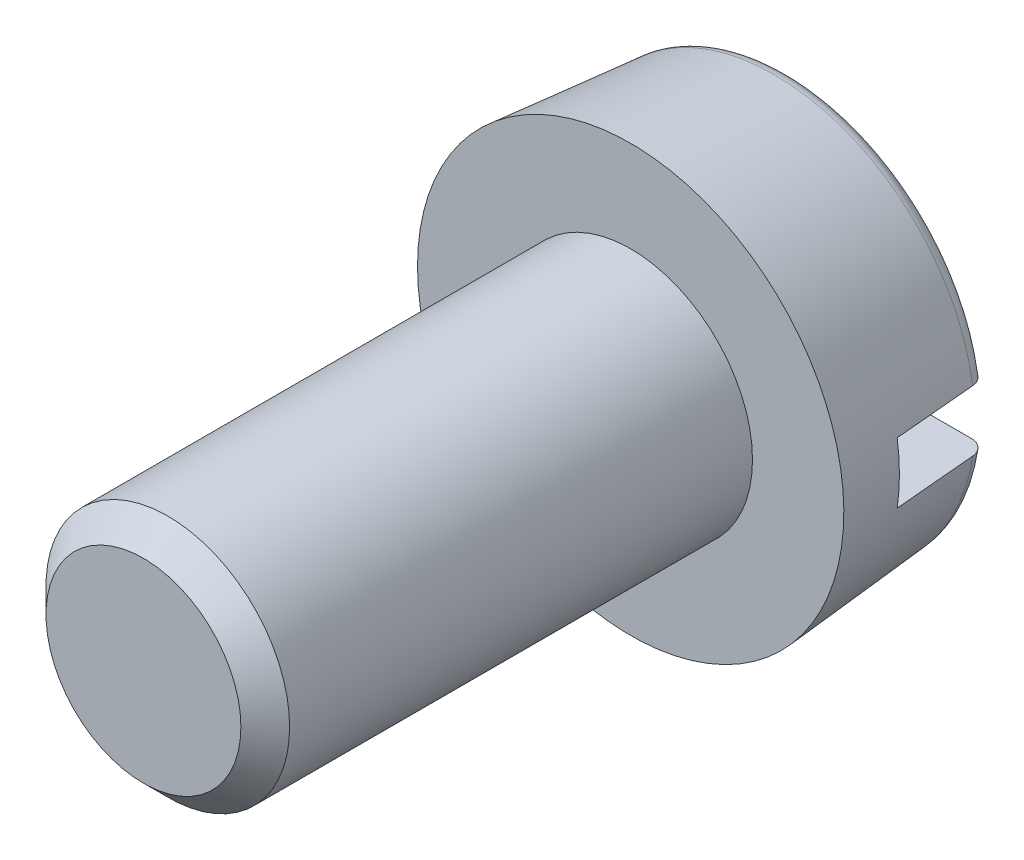
ISO-10303-21;
HEADER;
FILE_DESCRIPTION(('STEP AP214'),'2;1');
FILE_NAME('part.step','',(''),(''),'','','');
FILE_SCHEMA(('AUTOMOTIVE_DESIGN { 1 0 10303 214 1 1 1 1 }'));
ENDSEC;
DATA;
#1=APPLICATION_CONTEXT('core data for automotive mechanical design processes');
#2=APPLICATION_PROTOCOL_DEFINITION('international standard','automotive_design',2000,#1);
#3=PRODUCT_CONTEXT('',#1,'mechanical');
#4=PRODUCT('Part','Part','',(#3));
#5=PRODUCT_RELATED_PRODUCT_CATEGORY('part','',(#4));
#6=PRODUCT_DEFINITION_FORMATION('','',#4);
#7=PRODUCT_DEFINITION_CONTEXT('part definition',#1,'design');
#8=PRODUCT_DEFINITION('design','',#6,#7);
#9=PRODUCT_DEFINITION_SHAPE('','',#8);
#10=(LENGTH_UNIT() NAMED_UNIT(*) SI_UNIT(.MILLI.,.METRE.));
#11=(NAMED_UNIT(*) PLANE_ANGLE_UNIT() SI_UNIT($,.RADIAN.));
#12=(NAMED_UNIT(*) SI_UNIT($,.STERADIAN.) SOLID_ANGLE_UNIT());
#13=UNCERTAINTY_MEASURE_WITH_UNIT(LENGTH_MEASURE(1.E-05),#10,'distance_accuracy_value','');
#14=(GEOMETRIC_REPRESENTATION_CONTEXT(3) GLOBAL_UNCERTAINTY_ASSIGNED_CONTEXT((#13)) GLOBAL_UNIT_ASSIGNED_CONTEXT((#10,
#11,#12)) REPRESENTATION_CONTEXT('',''));
#15=CARTESIAN_POINT('',(0.,0.,0.));
#16=DIRECTION('',(0.,0.,1.));
#17=DIRECTION('',(1.,0.,0.));
#18=AXIS2_PLACEMENT_3D('',#15,#16,#17);
#19=CARTESIAN_POINT('',(0.,0.,-2.6));
#20=DIRECTION('',(0.,0.,1.));
#21=DIRECTION('',(1.,0.,0.));
#22=AXIS2_PLACEMENT_3D('',#19,#20,#21);
#23=PLANE('',#22);
#24=DIRECTION('',(1.,0.,0.));
#25=VECTOR('',#24,1.);
#26=CARTESIAN_POINT('',(-3.5,-0.5,-2.6));
#27=LINE('',#26,#25);
#28=CARTESIAN_POINT('',(-2.99280396400411,-0.5,-2.6));
#29=VERTEX_POINT('',#28);
#30=CARTESIAN_POINT('',(2.99280396400411,-0.5,-2.6));
#31=VERTEX_POINT('',#30);
#32=EDGE_CURVE('E179',#29,#31,#27,.T.);
#33=ORIENTED_EDGE('',*,*,#32,.T.);
#34=CARTESIAN_POINT('',(0.,0.,-2.6));
#35=DIRECTION('',(0.,0.,-1.));
#36=DIRECTION('',(-1.,0.,0.));
#37=AXIS2_PLACEMENT_3D('',#34,#35,#36);
#38=CIRCLE('',#37,3.03428336958807);
#39=EDGE_CURVE('E111',#31,#29,#38,.T.);
#40=ORIENTED_EDGE('',*,*,#39,.T.);
#41=EDGE_LOOP('',(#33,#40));
#42=FACE_BOUND('',#41,.T.);
#43=ADVANCED_FACE('F30',(#42),#23,.F.);
#44=DIRECTION('',(-1.,0.,0.));
#45=VECTOR('',#44,1.);
#46=CARTESIAN_POINT('',(-3.5,0.5,-2.6));
#47=LINE('',#46,#45);
#48=CARTESIAN_POINT('',(2.99280396400411,0.5,-2.6));
#49=VERTEX_POINT('',#48);
#50=CARTESIAN_POINT('',(-2.99280396400411,0.5,-2.6));
#51=VERTEX_POINT('',#50);
#52=EDGE_CURVE('E96',#49,#51,#47,.T.);
#53=ORIENTED_EDGE('',*,*,#52,.T.);
#54=EDGE_CURVE('E108',#51,#49,#38,.T.);
#55=ORIENTED_EDGE('',*,*,#54,.T.);
#56=EDGE_LOOP('',(#53,#55));
#57=FACE_BOUND('',#56,.T.);
#58=ADVANCED_FACE('F173',(#57),#23,.F.);
#59=CARTESIAN_POINT('',(0.,0.,-2.34));
#60=DIRECTION('',(0.,0.,-1.));
#61=DIRECTION('',(-1.,0.,0.));
#62=AXIS2_PLACEMENT_3D('',#59,#60,#61);
#63=TOROIDAL_SURFACE('',#62,3.03428336958807,0.26);
#64=CARTESIAN_POINT('',(-3.20593369474659,-0.5,-2.49273899856779));
#65=CARTESIAN_POINT('',(-3.21452220271325,-0.5,-2.48104813338408));
#66=CARTESIAN_POINT('',(-3.22213584341061,-0.5,-2.4686288627877));
#67=CARTESIAN_POINT('',(-3.23517931236764,-0.5,-2.44267992199898));
#68=CARTESIAN_POINT('',(-3.24060678530229,-0.5,-2.42914907300705));
#69=CARTESIAN_POINT('',(-3.2491065548927,-0.5,-2.40136759729504));
#70=CARTESIAN_POINT('',(-3.25217924219696,-0.5,-2.38711709038131));
#71=CARTESIAN_POINT('',(-3.25587593453628,-0.5,-2.35830538963513));
#72=CARTESIAN_POINT('',(-3.25650051326893,-0.5,-2.34374426939708));
#73=CARTESIAN_POINT('',(-3.25528642330766,-0.5,-2.31478610007677));
#74=CARTESIAN_POINT('',(-3.25345800709215,-0.5,-2.30038862016556));
#75=CARTESIAN_POINT('',(-3.24741106508014,-0.5,-2.27210454535758));
#76=CARTESIAN_POINT('',(-3.24319247697078,-0.5,-2.25821796379022));
#77=CARTESIAN_POINT('',(-3.23248845989605,-0.5,-2.23133883224489));
#78=CARTESIAN_POINT('',(-3.22600169280323,-0.5,-2.21834681544885));
#79=CARTESIAN_POINT('',(-3.21095392642225,-0.5,-2.1936258853226));
#80=CARTESIAN_POINT('',(-3.20239287233723,-0.5,-2.18189700537277));
#81=CARTESIAN_POINT('',(-3.1833771675308,-0.5,-2.1599421385381));
#82=CARTESIAN_POINT('',(-3.17290934342269,-0.5,-2.14972756473587));
#83=CARTESIAN_POINT('',(-3.15042433218451,-0.5,-2.13117694145452));
#84=CARTESIAN_POINT('',(-3.13840706195465,-0.5,-2.12284099279562));
#85=CARTESIAN_POINT('',(-3.11301845792289,-0.5,-2.10818216976063));
#86=CARTESIAN_POINT('',(-3.09963325068401,-0.5,-2.10188332547994));
#87=CARTESIAN_POINT('',(-3.07200360115116,-0.5,-2.09159292949791));
#88=CARTESIAN_POINT('',(-3.05775910228206,-0.5,-2.08760152990051));
#89=CARTESIAN_POINT('',(-3.02863847081055,-0.5,-2.08199385546648));
#90=CARTESIAN_POINT('',(-3.01375693116852,-0.5,-2.0804056431824));
#91=CARTESIAN_POINT('',(-2.98393701863345,-0.5,-2.07973102219478));
#92=CARTESIAN_POINT('',(-2.96899864291793,-0.5,-2.08064473939937));
#93=CARTESIAN_POINT('',(-2.93937852828282,-0.5,-2.08496295941936));
#94=CARTESIAN_POINT('',(-2.92469933000086,-0.5,-2.08838491781102));
#95=CARTESIAN_POINT('',(-2.89612444963107,-0.5,-2.09764767873732));
#96=CARTESIAN_POINT('',(-2.88222877533598,-0.5,-2.10348850532463));
#97=CARTESIAN_POINT('',(-2.85564093115413,-0.5,-2.11742304618296));
#98=CARTESIAN_POINT('',(-2.84294711427197,-0.5,-2.12551361576139));
#99=CARTESIAN_POINT('',(-2.81911627100345,-0.5,-2.14373207198906));
#100=CARTESIAN_POINT('',(-2.80797917064795,-0.5,-2.15385986178169));
#101=CARTESIAN_POINT('',(-2.78770744597602,-0.5,-2.175756076833));
#102=CARTESIAN_POINT('',(-2.77855308328318,-0.5,-2.18750622142483));
#103=CARTESIAN_POINT('',(-2.76238342374972,-0.5,-2.21239644834434));
#104=CARTESIAN_POINT('',(-2.75536793604153,-0.5,-2.22553640650768));
#105=CARTESIAN_POINT('',(-2.74378882508634,-0.5,-2.25261692147902));
#106=CARTESIAN_POINT('',(-2.73918923203743,-0.5,-2.26654210019322));
#107=CARTESIAN_POINT('',(-2.73242630573013,-0.5,-2.29497183489064));
#108=CARTESIAN_POINT('',(-2.7302627727796,-0.5,-2.3094763432833));
#109=CARTESIAN_POINT('',(-2.72845260975428,-0.5,-2.33846034491868));
#110=CARTESIAN_POINT('',(-2.72877510224971,-0.5,-2.35293791806825));
#111=CARTESIAN_POINT('',(-2.73185338355943,-0.5,-2.38163157092323));
#112=CARTESIAN_POINT('',(-2.73460910293002,-0.5,-2.39584765807956));
#113=CARTESIAN_POINT('',(-2.74245689313699,-0.5,-2.42357874057575));
#114=CARTESIAN_POINT('',(-2.74754285926759,-0.5,-2.43709546573835));
#115=CARTESIAN_POINT('',(-2.75989322745267,-0.5,-2.46309346872102));
#116=CARTESIAN_POINT('',(-2.76715770067522,-0.5,-2.4755747126967));
#117=CARTESIAN_POINT('',(-2.78371912986246,-0.5,-2.49926528583612));
#118=CARTESIAN_POINT('',(-2.79303287134872,-0.5,-2.51046287530082));
#119=CARTESIAN_POINT('',(-2.81338307684471,-0.5,-2.53116410353192));
#120=CARTESIAN_POINT('',(-2.82441967122935,-0.5,-2.54066761398417));
#121=CARTESIAN_POINT('',(-2.84807721730978,-0.5,-2.5578611250184));
#122=CARTESIAN_POINT('',(-2.86071925596729,-0.5,-2.56552211079317));
#123=CARTESIAN_POINT('',(-2.88709689747581,-0.5,-2.57864615609097));
#124=CARTESIAN_POINT('',(-2.90083258653046,-0.5,-2.58410904214966));
#125=CARTESIAN_POINT('',(-2.92920867832833,-0.5,-2.59275435908575));
#126=CARTESIAN_POINT('',(-2.94385884480904,-0.5,-2.59590476451403));
#127=CARTESIAN_POINT('',(-2.97347913254951,-0.5,-2.59971834491272));
#128=CARTESIAN_POINT('',(-2.98844925623819,-0.5,-2.60038150099482));
#129=CARTESIAN_POINT('',(-3.01838249868834,-0.5,-2.59919693060953));
#130=CARTESIAN_POINT('',(-3.03334500986341,-0.5,-2.5973337595709));
#131=CARTESIAN_POINT('',(-3.06274709456839,-0.5,-2.59111373679896));
#132=CARTESIAN_POINT('',(-3.0771865403437,-0.5,-2.58675628016456));
#133=CARTESIAN_POINT('',(-3.10508461166053,-0.5,-2.57567635398572));
#134=CARTESIAN_POINT('',(-3.11854561192526,-0.5,-2.56895985815267));
#135=CARTESIAN_POINT('',(-3.14412097507063,-0.5,-2.55334434941676));
#136=CARTESIAN_POINT('',(-3.15623699692517,-0.5,-2.544448069644));
#137=CARTESIAN_POINT('',(-3.17464140017305,-0.5,-2.5283401408746));
#138=CARTESIAN_POINT('',(-3.18144049842887,-0.5,-2.52170233381963));
#139=CARTESIAN_POINT('',(-3.19427675790767,-0.5,-2.50772663813578));
#140=CARTESIAN_POINT('',(-3.20031392383908,-0.5,-2.50038875383356));
#141=CARTESIAN_POINT('',(-3.20593369474659,-0.5,-2.49273899856779));
#142=B_SPLINE_CURVE_WITH_KNOTS('',3,(#64,#65,#66,#67,#68,#69,#70,#71,#72,#73,#74,#75,#76,#77,
#78,#79,#80,#81,#82,#83,#84,#85,#86,#87,#88,#89,#90,#91,#92,#93,#94,#95,#96,#97,#98,#99,#100,
#101,#102,#103,#104,#105,#106,#107,#108,#109,#110,#111,#112,#113,#114,#115,#116,#117,#118,#119,
#120,#121,#122,#123,#124,#125,#126,#127,#128,#129,#130,#131,#132,#133,#134,#135,#136,#137,#138,
#139,#140,#141),.UNSPECIFIED.,.T.,.F.,(4,2,2,2,2,2,2,2,2,2,2,2,2,2,2,2,2,2,2,2,2,2,2,2,2,2,2,2,
2,2,2,2,2,2,2,2,2,2,4),(0.,0.0434852510287901,0.0870172275178059,0.130541980680772,
0.174056533504141,0.217389779393624,0.260724155052558,0.304084139373146,0.347445269268476,
0.391118190178882,0.434793454327282,0.478966571063346,0.523142599305569,0.567830604432421,
0.612520858498186,0.657525113898355,0.702529816821347,0.74747192564994,0.792411898277678,
0.836881519284919,0.881347170778003,0.925130539160346,0.968910318209782,1.01214721913116,
1.05538288612203,1.0985059276981,1.14163037818318,1.18512216086347,1.22861723633092,
1.27275797390959,1.31690219419777,1.36164679120674,1.40639172800783,1.45141144759807,
1.4964420897637,1.54135951491617,1.58622090583675,1.61467505175114,1.64312902182213),.UNSPECIFIED.);
#143=CARTESIAN_POINT('',(-3.25511678926616,-0.5,-2.3626604931144));
#144=VERTEX_POINT('',#143);
#145=EDGE_CURVE('E53',#29,#144,#142,.T.);
#146=ORIENTED_EDGE('',*,*,#145,.F.);
#147=ORIENTED_EDGE('',*,*,#39,.F.);
#148=CARTESIAN_POINT('',(2.77362660648471,-0.5,-2.48479543433262));
#149=CARTESIAN_POINT('',(2.76548434377266,-0.5,-2.47284351647634));
#150=CARTESIAN_POINT('',(2.75833631926308,-0.5,-2.46020266796051));
#151=CARTESIAN_POINT('',(2.74625336803657,-0.5,-2.4338924572634));
#152=CARTESIAN_POINT('',(2.74132071275871,-0.5,-2.42022205615992));
#153=CARTESIAN_POINT('',(2.73382888982592,-0.5,-2.3922442790159));
#154=CARTESIAN_POINT('',(2.73126965018894,-0.5,-2.37793692230703));
#155=CARTESIAN_POINT('',(2.72860695158317,-0.5,-2.34909883690085));
#156=CARTESIAN_POINT('',(2.72850291922231,-0.5,-2.33456816115097));
#157=CARTESIAN_POINT('',(2.73074543493986,-0.5,-2.30578417778823));
#158=CARTESIAN_POINT('',(2.73307747915418,-0.5,-2.29152973740069));
#159=CARTESIAN_POINT('',(2.74009676874072,-0.5,-2.26361314063755));
#160=CARTESIAN_POINT('',(2.74478408864379,-0.5,-2.24995100301977));
#161=CARTESIAN_POINT('',(2.75638249838008,-0.5,-2.2235704935892));
#162=CARTESIAN_POINT('',(2.76329847620496,-0.5,-2.21085427256405));
#163=CARTESIAN_POINT('',(2.77914304863994,-0.5,-2.18674511689351));
#164=CARTESIAN_POINT('',(2.78807174870204,-0.5,-2.17535225162976));
#165=CARTESIAN_POINT('',(2.80779938203967,-0.5,-2.15406460248884));
#166=CARTESIAN_POINT('',(2.81861943186967,-0.5,-2.14418939283496));
#167=CARTESIAN_POINT('',(2.84174230660068,-0.5,-2.12636266404885));
#168=CARTESIAN_POINT('',(2.8540452477932,-0.5,-2.11841129593565));
#169=CARTESIAN_POINT('',(2.87998625427566,-0.5,-2.10453163452024));
#170=CARTESIAN_POINT('',(2.89364181581591,-0.5,-2.09863603477145));
#171=CARTESIAN_POINT('',(2.92174199088646,-0.5,-2.08919230624926));
#172=CARTESIAN_POINT('',(2.93618665845894,-0.5,-2.0856443384729));
#173=CARTESIAN_POINT('',(2.96562688314982,-0.5,-2.08096320164792));
#174=CARTESIAN_POINT('',(2.98062677125369,-0.5,-2.07985722899321));
#175=CARTESIAN_POINT('',(3.01060035163927,-0.5,-2.08017230910326));
#176=CARTESIAN_POINT('',(3.02557404323045,-0.5,-2.08159342750684));
#177=CARTESIAN_POINT('',(3.05510647715322,-0.5,-2.0869352592844));
#178=CARTESIAN_POINT('',(3.06966413916193,-0.5,-2.09086195426326));
#179=CARTESIAN_POINT('',(3.09790702585799,-0.5,-2.10111896563037));
#180=CARTESIAN_POINT('',(3.1115922709,-0.5,-2.10744922591619));
#181=CARTESIAN_POINT('',(3.13760610336357,-0.5,-2.12229619080729));
#182=CARTESIAN_POINT('',(3.14994271679849,-0.5,-2.13079882699832));
#183=CARTESIAN_POINT('',(3.17299205377991,-0.5,-2.14977690754756));
#184=CARTESIAN_POINT('',(3.18370487312726,-0.5,-2.16025223543878));
#185=CARTESIAN_POINT('',(3.2030703127134,-0.5,-2.18275038370219));
#186=CARTESIAN_POINT('',(3.21174515723774,-0.5,-2.19475407304892));
#187=CARTESIAN_POINT('',(3.22692841209813,-0.5,-2.22006136975126));
#188=CARTESIAN_POINT('',(3.23343696833923,-0.5,-2.23336488948187));
#189=CARTESIAN_POINT('',(3.24402537589002,-0.5,-2.26072709827005));
#190=CARTESIAN_POINT('',(3.24813264826033,-0.5,-2.27477517933731));
#191=CARTESIAN_POINT('',(3.25391041242755,-0.5,-2.30336369862032));
#192=CARTESIAN_POINT('',(3.2555810258219,-0.5,-2.31790411222998));
#193=CARTESIAN_POINT('',(3.25643125043229,-0.5,-2.34694784901642));
#194=CARTESIAN_POINT('',(3.25562947218483,-0.5,-2.36145063085767));
#195=CARTESIAN_POINT('',(3.25159984810051,-0.5,-2.39011483118658));
#196=CARTESIAN_POINT('',(3.24837204063606,-0.5,-2.40427625506985));
#197=CARTESIAN_POINT('',(3.23959162042172,-0.5,-2.43184461068387));
#198=CARTESIAN_POINT('',(3.2340410802896,-0.5,-2.44525220300339));
#199=CARTESIAN_POINT('',(3.22078064976424,-0.5,-2.47095278300874));
#200=CARTESIAN_POINT('',(3.21307071646258,-0.5,-2.48324574853985));
#201=CARTESIAN_POINT('',(3.19566551647954,-0.5,-2.50644928032956));
#202=CARTESIAN_POINT('',(3.18595873662297,-0.5,-2.51735120758729));
#203=CARTESIAN_POINT('',(3.1648702099064,-0.5,-2.53739204695808));
#204=CARTESIAN_POINT('',(3.15348837507966,-0.5,-2.54653086642195));
#205=CARTESIAN_POINT('',(3.12924254200707,-0.5,-2.56289277810776));
#206=CARTESIAN_POINT('',(3.1163638635047,-0.5,-2.57009411372228));
#207=CARTESIAN_POINT('',(3.08959088912846,-0.5,-2.58226175368982));
#208=CARTESIAN_POINT('',(3.07569652570156,-0.5,-2.58722790922388));
#209=CARTESIAN_POINT('',(3.04710871463752,-0.5,-2.5948446874558));
#210=CARTESIAN_POINT('',(3.03240769892263,-0.5,-2.59746691382344));
#211=CARTESIAN_POINT('',(3.00277466892433,-0.5,-2.60022853226898));
#212=CARTESIAN_POINT('',(2.98784265052461,-0.5,-2.60036788005249));
#213=CARTESIAN_POINT('',(2.95804002041125,-0.5,-2.5981541041027));
#214=CARTESIAN_POINT('',(2.9431709355973,-0.5,-2.59578037572239));
#215=CARTESIAN_POINT('',(2.91403721145855,-0.5,-2.58857139094286));
#216=CARTESIAN_POINT('',(2.89977273324622,-0.5,-2.58373548284645));
#217=CARTESIAN_POINT('',(2.87224730695565,-0.5,-2.57172586610504));
#218=CARTESIAN_POINT('',(2.85898742835027,-0.5,-2.56454970801183));
#219=CARTESIAN_POINT('',(2.83388686185452,-0.5,-2.54805876338612));
#220=CARTESIAN_POINT('',(2.82204445172052,-0.5,-2.53874661309159));
#221=CARTESIAN_POINT('',(2.80406578573151,-0.5,-2.5219325246986));
#222=CARTESIAN_POINT('',(2.79740698439202,-0.5,-2.51498036040642));
#223=CARTESIAN_POINT('',(2.78489446104058,-0.5,-2.50038547554085));
#224=CARTESIAN_POINT('',(2.77904073401392,-0.5,-2.49274275926932));
#225=CARTESIAN_POINT('',(2.77362660648471,-0.5,-2.48479543433262));
#226=B_SPLINE_CURVE_WITH_KNOTS('',3,(#148,#149,#150,#151,#152,#153,#154,#155,#156,#157,#158,
#159,#160,#161,#162,#163,#164,#165,#166,#167,#168,#169,#170,#171,#172,#173,#174,#175,#176,#177,
#178,#179,#180,#181,#182,#183,#184,#185,#186,#187,#188,#189,#190,#191,#192,#193,#194,#195,#196,
#197,#198,#199,#200,#201,#202,#203,#204,#205,#206,#207,#208,#209,#210,#211,#212,#213,#214,#215,
#216,#217,#218,#219,#220,#221,#222,#223,#224,#225),.UNSPECIFIED.,.T.,.F.,(4,2,2,2,2,2,2,2,2,2,2,
2,2,2,2,2,2,2,2,2,2,2,2,2,2,2,2,2,2,2,2,2,2,2,2,2,2,2,4),(0.,0.0433509686210105,
0.086746284493296,0.130140284209279,0.173524149538212,0.216651181076621,0.259779577422047,
0.303003216136453,0.346229119981718,0.389972677327543,0.433719667371707,0.478133653661826,
0.522550685480218,0.567459944456967,0.612370369926906,0.657388413995059,0.702405407346226,
0.747137948112329,0.791867848713237,0.836084618715083,0.880298410001463,0.923996916335289,
0.967693241892682,1.01106145530646,1.05442898278128,1.09775789484022,1.14108766793133,
1.18467464436337,1.22826391061495,1.27232395747124,1.3163869374249,1.36097676926349,
1.4055673965811,1.45052647340312,1.49549745632092,1.5405156604947,1.58547859941917,
1.61430463254667,1.64313048611218),.UNSPECIFIED.);
#227=CARTESIAN_POINT('',(3.25511678926612,-0.5,-2.36266049311439));
#228=VERTEX_POINT('',#227);
#229=EDGE_CURVE('E129',#228,#31,#226,.T.);
#230=ORIENTED_EDGE('',*,*,#229,.F.);
#231=CARTESIAN_POINT('',(0.,0.,-2.36266049311439));
#232=DIRECTION('',(0.,0.,-1.));
#233=DIRECTION('',(-1.,0.,0.));
#234=AXIS2_PLACEMENT_3D('',#231,#232,#233);
#235=CIRCLE('',#234,3.29329399109192);
#236=EDGE_CURVE('E120',#228,#144,#235,.T.);
#237=ORIENTED_EDGE('',*,*,#236,.T.);
#238=EDGE_LOOP('',(#146,#147,#230,#237));
#239=FACE_BOUND('',#238,.T.);
#240=ADVANCED_FACE('F133',(#239),#63,.T.);
#241=CARTESIAN_POINT('',(-3.20593369474659,0.5,-2.49273899856779));
#242=CARTESIAN_POINT('',(-3.19720688541383,0.5,-2.50461588217407));
#243=CARTESIAN_POINT('',(-3.18746088556262,0.5,-2.51575822709892));
#244=CARTESIAN_POINT('',(-3.16622271476577,0.5,-2.53625162913304));
#245=CARTESIAN_POINT('',(-3.15472821730277,0.5,-2.54560026151749));
#246=CARTESIAN_POINT('',(-3.1303476329348,0.5,-2.56223273019996));
#247=CARTESIAN_POINT('',(-3.11746294605955,0.5,-2.56951861752757));
#248=CARTESIAN_POINT('',(-3.09066557060194,0.5,-2.58184341943516));
#249=CARTESIAN_POINT('',(-3.07675313670873,0.5,-2.58688288854393));
#250=CARTESIAN_POINT('',(-3.04815896635946,0.5,-2.59462446837375));
#251=CARTESIAN_POINT('',(-3.03347146921679,0.5,-2.5973053033989));
#252=CARTESIAN_POINT('',(-3.00385434091604,0.5,-2.60018603380814));
#253=CARTESIAN_POINT('',(-2.98892468619421,0.5,-2.60038568628655));
#254=CARTESIAN_POINT('',(-2.95911402256275,0.5,-2.59829256672245));
#255=CARTESIAN_POINT('',(-2.94423448680728,0.5,-2.59597875194643));
#256=CARTESIAN_POINT('',(-2.91507381094591,0.5,-2.58888818435915));
#257=CARTESIAN_POINT('',(-2.90079268240679,0.5,-2.58411138396386));
#258=CARTESIAN_POINT('',(-2.87322792260064,0.5,-2.57221805424375));
#259=CARTESIAN_POINT('',(-2.85994498460764,0.5,-2.5650999169051));
#260=CARTESIAN_POINT('',(-2.8347762484992,0.5,-2.54871630179204));
#261=CARTESIAN_POINT('',(-2.82289039897779,0.5,-2.53945090306356));
#262=CARTESIAN_POINT('',(-2.80096835215705,0.5,-2.51911588168015));
#263=CARTESIAN_POINT('',(-2.79091707277461,0.5,-2.5080625252758));
#264=CARTESIAN_POINT('',(-2.77284652295217,0.5,-2.48440332500151));
#265=CARTESIAN_POINT('',(-2.76482708544262,0.5,-2.4717976089021));
#266=CARTESIAN_POINT('',(-2.75117573745477,0.5,-2.44559185840432));
#267=CARTESIAN_POINT('',(-2.74551011292651,0.5,-2.4320093871445));
#268=CARTESIAN_POINT('',(-2.73657585444551,0.5,-2.40407781763161));
#269=CARTESIAN_POINT('',(-2.73330700776059,0.5,-2.38972878753777));
#270=CARTESIAN_POINT('',(-2.72929919999381,0.5,-2.36088361061245));
#271=CARTESIAN_POINT('',(-2.72852602670096,0.5,-2.34639220933991));
#272=CARTESIAN_POINT('',(-2.72943755689883,0.5,-2.31748731966548));
#273=CARTESIAN_POINT('',(-2.73112215518155,0.5,-2.30307382795508));
#274=CARTESIAN_POINT('',(-2.73688073657628,0.5,-2.2748102951889));
#275=CARTESIAN_POINT('',(-2.74094240542295,0.5,-2.26095774081104));
#276=CARTESIAN_POINT('',(-2.75131958691041,0.5,-2.2341248234271));
#277=CARTESIAN_POINT('',(-2.75763514644537,0.5,-2.22114447857478));
#278=CARTESIAN_POINT('',(-2.77237589083349,0.5,-2.19633280251963));
#279=CARTESIAN_POINT('',(-2.78081407033614,0.5,-2.18450919599516));
#280=CARTESIAN_POINT('',(-2.79953010912539,0.5,-2.16242134235513));
#281=CARTESIAN_POINT('',(-2.80980809345106,0.5,-2.15215720131357));
#282=CARTESIAN_POINT('',(-2.83206536583045,0.5,-2.13332447239675));
#283=CARTESIAN_POINT('',(-2.84406655523576,0.5,-2.12478177105084));
#284=CARTESIAN_POINT('',(-2.8693161767302,0.5,-2.10979839711805));
#285=CARTESIAN_POINT('',(-2.88256470801127,0.5,-2.10335789188563));
#286=CARTESIAN_POINT('',(-2.9101397498542,0.5,-2.092667495122));
#287=CARTESIAN_POINT('',(-2.92447910561316,0.5,-2.08845072160996));
#288=CARTESIAN_POINT('',(-2.95365982758526,0.5,-2.0824622497156));
#289=CARTESIAN_POINT('',(-2.968501221605,0.5,-2.08069068699505));
#290=CARTESIAN_POINT('',(-2.99839471953416,0.5,-2.07963690440613));
#291=CARTESIAN_POINT('',(-3.01344755313629,0.5,-2.08037523110225));
#292=CARTESIAN_POINT('',(-3.04321554553384,0.5,-2.0843707619958));
#293=CARTESIAN_POINT('',(-3.05793070205606,0.5,-2.08762798314505));
#294=CARTESIAN_POINT('',(-3.08658686804634,0.5,-2.09657351983269));
#295=CARTESIAN_POINT('',(-3.10052864425509,0.5,-2.10225937709143));
#296=CARTESIAN_POINT('',(-3.12724780265048,0.5,-2.11591107797537));
#297=CARTESIAN_POINT('',(-3.14002522801632,0.5,-2.1238768370065));
#298=CARTESIAN_POINT('',(-3.16393077222168,0.5,-2.14179117966034));
#299=CARTESIAN_POINT('',(-3.17507232835939,0.5,-2.15172182729789));
#300=CARTESIAN_POINT('',(-3.19550476175455,0.5,-2.17333326409202));
#301=CARTESIAN_POINT('',(-3.20479575652713,0.5,-2.18501394203485));
#302=CARTESIAN_POINT('',(-3.22114384025315,0.5,-2.20964215859466));
#303=CARTESIAN_POINT('',(-3.2282265960437,0.5,-2.2225726604425));
#304=CARTESIAN_POINT('',(-3.24009365273487,0.5,-2.24944798686428));
#305=CARTESIAN_POINT('',(-3.24487819210615,0.5,-2.26339270602666));
#306=CARTESIAN_POINT('',(-3.25196408799988,0.5,-2.29174085941922));
#307=CARTESIAN_POINT('',(-3.25429139131072,0.5,-2.30613781285759));
#308=CARTESIAN_POINT('',(-3.25648210324061,0.5,-2.33512183299331));
#309=CARTESIAN_POINT('',(-3.25634497929081,0.5,-2.34970894010274));
#310=CARTESIAN_POINT('',(-3.2536172542851,0.5,-2.37857966577501));
#311=CARTESIAN_POINT('',(-3.25103837958194,0.5,-2.39286440142692));
#312=CARTESIAN_POINT('',(-3.24352292380342,0.5,-2.42078632431844));
#313=CARTESIAN_POINT('',(-3.23858925156557,0.5,-2.43442428771529));
#314=CARTESIAN_POINT('',(-3.2288992214661,0.5,-2.45550463531752));
#315=CARTESIAN_POINT('',(-3.22483666859579,0.5,-2.46327369107743));
#316=CARTESIAN_POINT('',(-3.21594731867276,0.5,-2.47836132323001));
#317=CARTESIAN_POINT('',(-3.21112052582052,0.5,-2.48567990209833));
#318=CARTESIAN_POINT('',(-3.20593369474659,0.5,-2.49273899856779));
#319=B_SPLINE_CURVE_WITH_KNOTS('',3,(#241,#242,#243,#244,#245,#246,#247,#248,#249,#250,#251,
#252,#253,#254,#255,#256,#257,#258,#259,#260,#261,#262,#263,#264,#265,#266,#267,#268,#269,#270,
#271,#272,#273,#274,#275,#276,#277,#278,#279,#280,#281,#282,#283,#284,#285,#286,#287,#288,#289,
#290,#291,#292,#293,#294,#295,#296,#297,#298,#299,#300,#301,#302,#303,#304,#305,#306,#307,#308,
#309,#310,#311,#312,#313,#314,#315,#316,#317,#318),.UNSPECIFIED.,.T.,.F.,(4,2,2,2,2,2,2,2,2,2,2,
2,2,2,2,2,2,2,2,2,2,2,2,2,2,2,2,2,2,2,2,2,2,2,2,2,2,2,4),(0.,0.0441824488836517,
0.088424208799138,0.132621822478673,0.17680851991847,0.221389826657519,0.265975497834778,
0.310937337175956,0.355900045196917,0.400893697994528,0.445885694729105,0.490489279051145,
0.535089194622806,0.579026225804548,0.622959356769853,0.666287609519021,0.709614007602053,
0.752717918251259,0.795822725767383,0.839198131225159,0.882576485735262,0.926565133397644,
0.970557282113717,1.01518731706505,1.05981982801815,1.10481858844321,1.14981765170638,
1.19477127419236,1.23972322892363,1.28428235413452,1.3288386488302,1.37285588174798,
1.41686854630245,1.4604116707364,1.50396420506053,1.54730863635034,1.59059966310266,
1.61685990892531,1.64312001041873),.UNSPECIFIED.);
#320=CARTESIAN_POINT('',(-3.25511678926612,0.5,-2.36266049311439));
#321=VERTEX_POINT('',#320);
#322=EDGE_CURVE('E185',#321,#51,#319,.T.);
#323=ORIENTED_EDGE('',*,*,#322,.F.);
#324=CARTESIAN_POINT('',(3.25511678926616,0.5,-2.3626604931144));
#325=VERTEX_POINT('',#324);
#326=EDGE_CURVE('E116',#321,#325,#235,.T.);
#327=ORIENTED_EDGE('',*,*,#326,.T.);
#328=CARTESIAN_POINT('',(2.77362660648471,0.5,-2.48479543433262));
#329=CARTESIAN_POINT('',(2.781944747143,0.5,-2.49700317770152));
#330=CARTESIAN_POINT('',(2.79131264473902,0.5,-2.50850990785024));
#331=CARTESIAN_POINT('',(2.81186186556356,0.5,-2.52979041740412));
#332=CARTESIAN_POINT('',(2.82304569712031,0.5,-2.5395617600815));
#333=CARTESIAN_POINT('',(2.84687786068542,0.5,-2.55708642539476));
#334=CARTESIAN_POINT('',(2.85952457087949,0.5,-2.56484195245133));
#335=CARTESIAN_POINT('',(2.88592611209174,0.5,-2.57814205378405));
#336=CARTESIAN_POINT('',(2.89968065960274,0.5,-2.58368719157461));
#337=CARTESIAN_POINT('',(2.92806082331067,0.5,-2.59247078883193));
#338=CARTESIAN_POINT('',(2.94269385715372,0.5,-2.59568529150908));
#339=CARTESIAN_POINT('',(2.97229203166628,0.5,-2.59962968781432));
#340=CARTESIAN_POINT('',(2.98725720227612,0.5,-2.60035935652491));
#341=CARTESIAN_POINT('',(3.01719519435438,0.5,-2.59930833320051));
#342=CARTESIAN_POINT('',(3.03216745789873,0.5,-2.59751162855014));
#343=CARTESIAN_POINT('',(3.06159617972975,0.5,-2.59142303175281));
#344=CARTESIAN_POINT('',(3.07605264040495,0.5,-2.58713115116182));
#345=CARTESIAN_POINT('',(3.10399181436949,0.5,-2.57617986966595));
#346=CARTESIAN_POINT('',(3.11747720610802,0.5,-2.56952730660565));
#347=CARTESIAN_POINT('',(3.14312449249899,0.5,-2.55403097626174));
#348=CARTESIAN_POINT('',(3.15528645192577,0.5,-2.5451873162891));
#349=CARTESIAN_POINT('',(3.17781124129096,0.5,-2.52565065507924));
#350=CARTESIAN_POINT('',(3.1881906207027,0.5,-2.51497673830944));
#351=CARTESIAN_POINT('',(3.20698316893376,0.5,-2.49201908845375));
#352=CARTESIAN_POINT('',(3.21539646766825,0.5,-2.47973546181843));
#353=CARTESIAN_POINT('',(3.22991013199528,0.5,-2.45406808458241));
#354=CARTESIAN_POINT('',(3.23603742465076,0.5,-2.44069955823365));
#355=CARTESIAN_POINT('',(3.24593552359215,0.5,-2.41311689550817));
#356=CARTESIAN_POINT('',(3.24970647223315,0.5,-2.3989028102715));
#357=CARTESIAN_POINT('',(3.2547513839243,0.5,-2.37018078951346));
#358=CARTESIAN_POINT('',(3.25604921849765,0.5,-2.35567704305253));
#359=CARTESIAN_POINT('',(3.25618101063095,0.5,-2.32665859338678));
#360=CARTESIAN_POINT('',(3.25501504581726,0.5,-2.31214389054157));
#361=CARTESIAN_POINT('',(3.25026412464445,0.5,-2.28357417739867));
#362=CARTESIAN_POINT('',(3.24668854720874,0.5,-2.26951760548129));
#363=CARTESIAN_POINT('',(3.23723540527897,0.5,-2.24220149828399));
#364=CARTESIAN_POINT('',(3.23135782846849,0.5,-2.22894196726893));
#365=CARTESIAN_POINT('',(3.21745308786568,0.5,-2.20354862426213));
#366=CARTESIAN_POINT('',(3.20941921781147,0.5,-2.1914184860656));
#367=CARTESIAN_POINT('',(3.19144614470347,0.5,-2.16866365562385));
#368=CARTESIAN_POINT('',(3.18150686627389,0.5,-2.15803902296366));
#369=CARTESIAN_POINT('',(3.15991078464721,0.5,-2.13849113263947));
#370=CARTESIAN_POINT('',(3.14823918320212,0.5,-2.12958422725794));
#371=CARTESIAN_POINT('',(3.12358097681021,0.5,-2.11382899994939));
#372=CARTESIAN_POINT('',(3.11059429160633,0.5,-2.10698080376279));
#373=CARTESIAN_POINT('',(3.08350799623619,0.5,-2.09545056192167));
#374=CARTESIAN_POINT('',(3.0693969031511,0.5,-2.0907954901117));
#375=CARTESIAN_POINT('',(3.04059764519861,0.5,-2.08389295840794));
#376=CARTESIAN_POINT('',(3.02590944389137,0.5,-2.08164565079963));
#377=CARTESIAN_POINT('',(2.9962085089611,0.5,-2.07960294157625));
#378=CARTESIAN_POINT('',(2.98119398749932,0.5,-2.07983347544934));
#379=CARTESIAN_POINT('',(2.95141420341958,0.5,-2.08280015114645));
#380=CARTESIAN_POINT('',(2.93664895021163,0.5,-2.08553638734754));
#381=CARTESIAN_POINT('',(2.90772187731308,0.5,-2.09345815606774));
#382=CARTESIAN_POINT('',(2.89356292123977,0.5,-2.09865415616274));
#383=CARTESIAN_POINT('',(2.86632394943896,0.5,-2.1113605731689));
#384=CARTESIAN_POINT('',(2.85324392467163,0.5,-2.1188709706864));
#385=CARTESIAN_POINT('',(2.82860759142219,0.5,-2.13596138913421));
#386=CARTESIAN_POINT('',(2.8170441918269,0.5,-2.14553118228424));
#387=CARTESIAN_POINT('',(2.7957142898716,0.5,-2.16649940491532));
#388=CARTESIAN_POINT('',(2.78594767115088,0.5,-2.17789771589079));
#389=CARTESIAN_POINT('',(2.76862730198483,0.5,-2.202043428556));
#390=CARTESIAN_POINT('',(2.76104650405093,0.5,-2.21477142388728));
#391=CARTESIAN_POINT('',(2.7481681334069,0.5,-2.24133387658088));
#392=CARTESIAN_POINT('',(2.74287025574774,0.5,-2.25516818587058));
#393=CARTESIAN_POINT('',(2.73478974161767,0.5,-2.28332247977124));
#394=CARTESIAN_POINT('',(2.73196973426304,0.5,-2.29763174563219));
#395=CARTESIAN_POINT('',(2.72879700904873,0.5,-2.32652503211091));
#396=CARTESIAN_POINT('',(2.72844476005817,0.5,-2.34110910441357));
#397=CARTESIAN_POINT('',(2.73021123649178,0.5,-2.36999395260011));
#398=CARTESIAN_POINT('',(2.7323079370758,0.5,-2.38429609519601));
#399=CARTESIAN_POINT('',(2.73886954090554,0.5,-2.41233320384149));
#400=CARTESIAN_POINT('',(2.74333150854185,0.5,-2.42606885026124));
#401=CARTESIAN_POINT('',(2.75224895957724,0.5,-2.44729543440507));
#402=CARTESIAN_POINT('',(2.75599683485368,0.5,-2.45509148709398));
#403=CARTESIAN_POINT('',(2.76425222540847,0.5,-2.47027016168981));
#404=CARTESIAN_POINT('',(2.7687597332275,0.5,-2.47765278765548));
#405=CARTESIAN_POINT('',(2.77362660648471,0.5,-2.48479543433262));
#406=B_SPLINE_CURVE_WITH_KNOTS('',3,(#328,#329,#330,#331,#332,#333,#334,#335,#336,#337,#338,
#339,#340,#341,#342,#343,#344,#345,#346,#347,#348,#349,#350,#351,#352,#353,#354,#355,#356,#357,
#358,#359,#360,#361,#362,#363,#364,#365,#366,#367,#368,#369,#370,#371,#372,#373,#374,#375,#376,
#377,#378,#379,#380,#381,#382,#383,#384,#385,#386,#387,#388,#389,#390,#391,#392,#393,#394,#395,
#396,#397,#398,#399,#400,#401,#402,#403,#404,#405),.UNSPECIFIED.,.T.,.F.,(4,2,2,2,2,2,2,2,2,2,2,
2,2,2,2,2,2,2,2,2,2,2,2,2,2,2,2,2,2,2,2,2,2,2,2,2,2,2,4),(0.,0.044284720078206,
0.0886311387871473,0.132928855909744,0.177215272583178,0.221950697183598,0.266690170952812,
0.311714493293257,0.356738607113134,0.401633356622593,0.446525907805283,0.490976036153808,
0.535423226484421,0.579328972646714,0.623232066050689,0.666709198530346,0.710184961206373,
0.753492473332608,0.796800217170775,0.840244244756801,0.883689991294341,0.927530863542524,
0.971374412929524,1.01574397011054,1.06011633339728,1.10495358926638,1.14979253399664,
1.19482403100798,1.23985515068477,1.28466758687995,1.32947711996988,1.37370571268561,
1.4179283955804,1.46147206798108,1.50502401336744,1.54818726732255,1.59129707496652,
1.61720794195152,1.64311855451573),.UNSPECIFIED.);
#407=EDGE_CURVE('E186',#49,#325,#406,.T.);
#408=ORIENTED_EDGE('',*,*,#407,.F.);
#409=ORIENTED_EDGE('',*,*,#54,.F.);
#410=EDGE_LOOP('',(#323,#327,#408,#409));
#411=FACE_BOUND('',#410,.T.);
#412=ADVANCED_FACE('F158',(#411),#63,.T.);
#413=CARTESIAN_POINT('',(0.,0.,0.));
#414=DIRECTION('',(0.,0.,1.));
#415=DIRECTION('',(1.,0.,0.));
#416=AXIS2_PLACEMENT_3D('',#413,#414,#415);
#417=CONICAL_SURFACE('',#416,3.5,0.0872664625997167);
#418=CARTESIAN_POINT('',(0.,0.,0.));
#419=DIRECTION('',(0.,0.,-1.));
#420=DIRECTION('',(-1.,0.,0.));
#421=AXIS2_PLACEMENT_3D('',#418,#419,#420);
#422=CIRCLE('',#421,3.5);
#423=CARTESIAN_POINT('',(-3.5,0.,0.));
#424=VERTEX_POINT('',#423);
#425=EDGE_CURVE('E121',#424,#424,#422,.T.);
#426=ORIENTED_EDGE('',*,*,#425,.T.);
#427=EDGE_LOOP('',(#426));
#428=FACE_BOUND('',#427,.T.);
#429=CARTESIAN_POINT('',(-2.76605522684133,-0.5,-7.87664685335244));
#430=CARTESIAN_POINT('',(-2.91868476970112,-0.5,-6.15972546754755));
#431=CARTESIAN_POINT('',(-3.07095610653264,-0.5,-4.4427723078274));
#432=CARTESIAN_POINT('',(-3.25199436408199,-0.5,-2.39797299342363));
#433=CARTESIAN_POINT('',(-3.28100914185022,-0.5,-2.07014878848912));
#434=CARTESIAN_POINT('',(-3.49094090158144,-0.5,0.302485444356628));
#435=CARTESIAN_POINT('',(-3.67152906159026,-0.5,2.34732457842937));
#436=CARTESIAN_POINT('',(-3.85195027784006,-0.5,4.3921783950621));
#437=B_SPLINE_CURVE_WITH_KNOTS('',3,(#429,#430,#431,#432,#433,#434,#435,#436),.UNSPECIFIED.,.F.,
.F.,(4,2,2,4),(0.,5.17107648601232,6.15839360793864,12.3167871447112),.UNSPECIFIED.);
#438=CARTESIAN_POINT('',(-3.37568268970353,-0.5,-1.));
#439=VERTEX_POINT('',#438);
#440=EDGE_CURVE('E81',#144,#439,#437,.T.);
#441=ORIENTED_EDGE('',*,*,#440,.F.);
#442=ORIENTED_EDGE('',*,*,#236,.F.);
#443=CARTESIAN_POINT('',(3.85195027784006,-0.5,4.3921783950621));
#444=CARTESIAN_POINT('',(3.76174768361346,-0.5,3.36975075870222));
#445=CARTESIAN_POINT('',(3.67149561900259,-0.5,2.34732748349246));
#446=CARTESIAN_POINT('',(3.4908610939243,-0.5,0.30249248077887));
#447=CARTESIAN_POINT('',(3.40047863346045,-0.5,-0.71991924672527));
#448=CARTESIAN_POINT('',(3.21955185553488,-0.5,-2.76472839723773));
#449=CARTESIAN_POINT('',(3.12900753807117,-0.5,-3.78712582024588));
#450=CARTESIAN_POINT('',(2.9477049101917,-0.5,-5.83190171897012));
#451=CARTESIAN_POINT('',(2.85694659977002,-0.5,-6.8542801946857));
#452=CARTESIAN_POINT('',(2.76605522684133,-0.5,-7.87664685335244));
#453=B_SPLINE_CURVE_WITH_KNOTS('',3,(#443,#444,#445,#446,#447,#448,#449,#450,#451,#452),
.UNSPECIFIED.,.F.,.F.,(4,2,2,2,4),(0.,3.07919681686875,6.15839354929429,9.23759031948045,
12.3167871748187),.UNSPECIFIED.);
#454=CARTESIAN_POINT('',(3.37568268970353,-0.5,-1.));
#455=VERTEX_POINT('',#454);
#456=EDGE_CURVE('E101',#455,#228,#453,.T.);
#457=ORIENTED_EDGE('',*,*,#456,.F.);
#458=CARTESIAN_POINT('',(0.,0.,-1.));
#459=DIRECTION('',(0.,0.,1.));
#460=DIRECTION('',(1.,0.,0.));
#461=AXIS2_PLACEMENT_3D('',#458,#459,#460);
#462=CIRCLE('',#461,3.41251133647408);
#463=CARTESIAN_POINT('',(3.37568268970353,0.5,-1.));
#464=VERTEX_POINT('',#463);
#465=EDGE_CURVE('E95',#455,#464,#462,.T.);
#466=ORIENTED_EDGE('',*,*,#465,.T.);
#467=CARTESIAN_POINT('',(2.76605522684133,0.5,-7.87664685335244));
#468=CARTESIAN_POINT('',(2.91868476970112,0.5,-6.15972546754755));
#469=CARTESIAN_POINT('',(3.07095610653264,0.5,-4.4427723078274));
#470=CARTESIAN_POINT('',(3.25199436408199,0.5,-2.39797299342363));
#471=CARTESIAN_POINT('',(3.28100914185022,0.5,-2.07014878848912));
#472=CARTESIAN_POINT('',(3.49094090158144,0.5,0.302485444356628));
#473=CARTESIAN_POINT('',(3.67152906159026,0.5,2.34732457842937));
#474=CARTESIAN_POINT('',(3.85195027784006,0.5,4.3921783950621));
#475=B_SPLINE_CURVE_WITH_KNOTS('',3,(#467,#468,#469,#470,#471,#472,#473,#474),.UNSPECIFIED.,.F.,
.F.,(4,2,2,4),(0.,5.17107648601232,6.15839360793864,12.3167871447112),.UNSPECIFIED.);
#476=EDGE_CURVE('E104',#325,#464,#475,.T.);
#477=ORIENTED_EDGE('',*,*,#476,.F.);
#478=ORIENTED_EDGE('',*,*,#326,.F.);
#479=CARTESIAN_POINT('',(-3.85195027784006,0.5,4.3921783950621));
#480=CARTESIAN_POINT('',(-3.76174768361346,0.5,3.36975075870222));
#481=CARTESIAN_POINT('',(-3.67149561900259,0.5,2.34732748349246));
#482=CARTESIAN_POINT('',(-3.4908610939243,0.5,0.30249248077887));
#483=CARTESIAN_POINT('',(-3.40047863346045,0.5,-0.71991924672527));
#484=CARTESIAN_POINT('',(-3.21955185553488,0.5,-2.76472839723773));
#485=CARTESIAN_POINT('',(-3.12900753807117,0.5,-3.78712582024588));
#486=CARTESIAN_POINT('',(-2.9477049101917,0.5,-5.83190171897012));
#487=CARTESIAN_POINT('',(-2.85694659977002,0.5,-6.8542801946857));
#488=CARTESIAN_POINT('',(-2.76605522684133,0.5,-7.87664685335244));
#489=B_SPLINE_CURVE_WITH_KNOTS('',3,(#479,#480,#481,#482,#483,#484,#485,#486,#487,#488),
.UNSPECIFIED.,.F.,.F.,(4,2,2,2,4),(0.,3.07919681686875,6.15839354929429,9.23759031948045,
12.3167871748187),.UNSPECIFIED.);
#490=CARTESIAN_POINT('',(-3.37568268970353,0.5,-1.));
#491=VERTEX_POINT('',#490);
#492=EDGE_CURVE('E90',#491,#321,#489,.T.);
#493=ORIENTED_EDGE('',*,*,#492,.F.);
#494=EDGE_CURVE('E93',#491,#439,#462,.T.);
#495=ORIENTED_EDGE('',*,*,#494,.T.);
#496=EDGE_LOOP('',(#441,#442,#457,#466,#477,#478,#493,#495));
#497=FACE_BOUND('',#496,.T.);
#498=ADVANCED_FACE('F99',(#428,#497),#417,.T.);
#499=CARTESIAN_POINT('',(0.,0.,0.));
#500=DIRECTION('',(0.,0.,-1.));
#501=DIRECTION('',(-1.,0.,0.));
#502=AXIS2_PLACEMENT_3D('',#499,#500,#501);
#503=PLANE('',#502);
#504=CARTESIAN_POINT('',(0.,0.,0.));
#505=DIRECTION('',(0.,0.,1.));
#506=DIRECTION('',(1.,0.,0.));
#507=AXIS2_PLACEMENT_3D('',#504,#505,#506);
#508=CIRCLE('',#507,2.);
#509=CARTESIAN_POINT('',(2.,0.,0.));
#510=VERTEX_POINT('',#509);
#511=EDGE_CURVE('E181',#510,#510,#508,.T.);
#512=ORIENTED_EDGE('',*,*,#511,.F.);
#513=EDGE_LOOP('',(#512));
#514=FACE_BOUND('',#513,.T.);
#515=ORIENTED_EDGE('',*,*,#425,.F.);
#516=EDGE_LOOP('',(#515));
#517=FACE_BOUND('',#516,.T.);
#518=ADVANCED_FACE('F141',(#514,#517),#503,.F.);
#519=CARTESIAN_POINT('',(-3.5,-0.5,-1.));
#520=DIRECTION('',(0.,1.,0.));
#521=DIRECTION('',(0.,0.,1.));
#522=AXIS2_PLACEMENT_3D('',#519,#520,#521);
#523=PLANE('',#522);
#524=ORIENTED_EDGE('',*,*,#145,.T.);
#525=ORIENTED_EDGE('',*,*,#440,.T.);
#526=DIRECTION('',(1.,0.,0.));
#527=VECTOR('',#526,1.);
#528=CARTESIAN_POINT('',(-3.5,-0.5,-1.));
#529=LINE('',#528,#527);
#530=EDGE_CURVE('E84',#439,#455,#529,.T.);
#531=ORIENTED_EDGE('',*,*,#530,.T.);
#532=ORIENTED_EDGE('',*,*,#456,.T.);
#533=ORIENTED_EDGE('',*,*,#229,.T.);
#534=ORIENTED_EDGE('',*,*,#32,.F.);
#535=EDGE_LOOP('',(#524,#525,#531,#532,#533,#534));
#536=FACE_BOUND('',#535,.T.);
#537=ADVANCED_FACE('F83',(#536),#523,.T.);
#538=CARTESIAN_POINT('',(-3.5,0.5,-1.));
#539=DIRECTION('',(0.,-1.,0.));
#540=DIRECTION('',(0.,0.,-1.));
#541=AXIS2_PLACEMENT_3D('',#538,#539,#540);
#542=PLANE('',#541);
#543=ORIENTED_EDGE('',*,*,#322,.T.);
#544=ORIENTED_EDGE('',*,*,#52,.F.);
#545=ORIENTED_EDGE('',*,*,#407,.T.);
#546=ORIENTED_EDGE('',*,*,#476,.T.);
#547=DIRECTION('',(-1.,0.,0.));
#548=VECTOR('',#547,1.);
#549=CARTESIAN_POINT('',(-3.5,0.5,-1.));
#550=LINE('',#549,#548);
#551=EDGE_CURVE('E45',#464,#491,#550,.T.);
#552=ORIENTED_EDGE('',*,*,#551,.T.);
#553=ORIENTED_EDGE('',*,*,#492,.T.);
#554=EDGE_LOOP('',(#543,#544,#545,#546,#552,#553));
#555=FACE_BOUND('',#554,.T.);
#556=ADVANCED_FACE('F140',(#555),#542,.T.);
#557=CARTESIAN_POINT('',(-3.5,-0.5,-1.));
#558=DIRECTION('',(0.,0.,1.));
#559=DIRECTION('',(1.,0.,0.));
#560=AXIS2_PLACEMENT_3D('',#557,#558,#559);
#561=PLANE('',#560);
#562=ORIENTED_EDGE('',*,*,#551,.F.);
#563=ORIENTED_EDGE('',*,*,#465,.F.);
#564=ORIENTED_EDGE('',*,*,#530,.F.);
#565=ORIENTED_EDGE('',*,*,#494,.F.);
#566=EDGE_LOOP('',(#562,#563,#564,#565));
#567=FACE_BOUND('',#566,.T.);
#568=ADVANCED_FACE('F92',(#567),#561,.F.);
#569=CARTESIAN_POINT('',(0.,0.,8.));
#570=DIRECTION('',(0.,0.,1.));
#571=DIRECTION('',(1.,0.,0.));
#572=AXIS2_PLACEMENT_3D('',#569,#570,#571);
#573=PLANE('',#572);
#574=CARTESIAN_POINT('',(0.,0.,8.));
#575=DIRECTION('',(0.,0.,1.));
#576=DIRECTION('',(1.,0.,0.));
#577=AXIS2_PLACEMENT_3D('',#574,#575,#576);
#578=CIRCLE('',#577,1.6);
#579=CARTESIAN_POINT('',(1.6,0.,8.));
#580=VERTEX_POINT('',#579);
#581=EDGE_CURVE('E38',#580,#580,#578,.T.);
#582=ORIENTED_EDGE('',*,*,#581,.T.);
#583=EDGE_LOOP('',(#582));
#584=FACE_BOUND('',#583,.T.);
#585=ADVANCED_FACE('F204',(#584),#573,.T.);
#586=CARTESIAN_POINT('',(0.,0.,0.));
#587=DIRECTION('',(0.,0.,1.));
#588=DIRECTION('',(1.,0.,0.));
#589=AXIS2_PLACEMENT_3D('',#586,#587,#588);
#590=CYLINDRICAL_SURFACE('',#589,2.);
#591=CARTESIAN_POINT('',(0.,0.,7.6));
#592=DIRECTION('',(0.,0.,1.));
#593=DIRECTION('',(1.,0.,0.));
#594=AXIS2_PLACEMENT_3D('',#591,#592,#593);
#595=CIRCLE('',#594,2.);
#596=CARTESIAN_POINT('',(2.,0.,7.6));
#597=VERTEX_POINT('',#596);
#598=EDGE_CURVE('E11',#597,#597,#595,.F.);
#599=ORIENTED_EDGE('',*,*,#598,.T.);
#600=EDGE_LOOP('',(#599));
#601=FACE_BOUND('',#600,.T.);
#602=ORIENTED_EDGE('',*,*,#511,.T.);
#603=EDGE_LOOP('',(#602));
#604=FACE_BOUND('',#603,.T.);
#605=ADVANCED_FACE('F200',(#601,#604),#590,.T.);
#606=CARTESIAN_POINT('',(0.,0.,8.));
#607=DIRECTION('',(0.,0.,-1.));
#608=DIRECTION('',(-1.,0.,0.));
#609=AXIS2_PLACEMENT_3D('',#606,#607,#608);
#610=CONICAL_SURFACE('',#609,1.6,0.785398163397446);
#611=ORIENTED_EDGE('',*,*,#598,.F.);
#612=EDGE_LOOP('',(#611));
#613=FACE_BOUND('',#612,.T.);
#614=ORIENTED_EDGE('',*,*,#581,.F.);
#615=EDGE_LOOP('',(#614));
#616=FACE_BOUND('',#615,.T.);
#617=ADVANCED_FACE('F32',(#613,#616),#610,.T.);
#618=CLOSED_SHELL('',(#43,#58,#240,#412,#498,#518,#537,#556,#568,#585,#605,#617));
#619=MANIFOLD_SOLID_BREP('B2',#618);
#620=ADVANCED_BREP_SHAPE_REPRESENTATION('',(#18,#619),#14);
#621=SHAPE_DEFINITION_REPRESENTATION(#9,#620);
ENDSEC;
END-ISO-10303-21;
